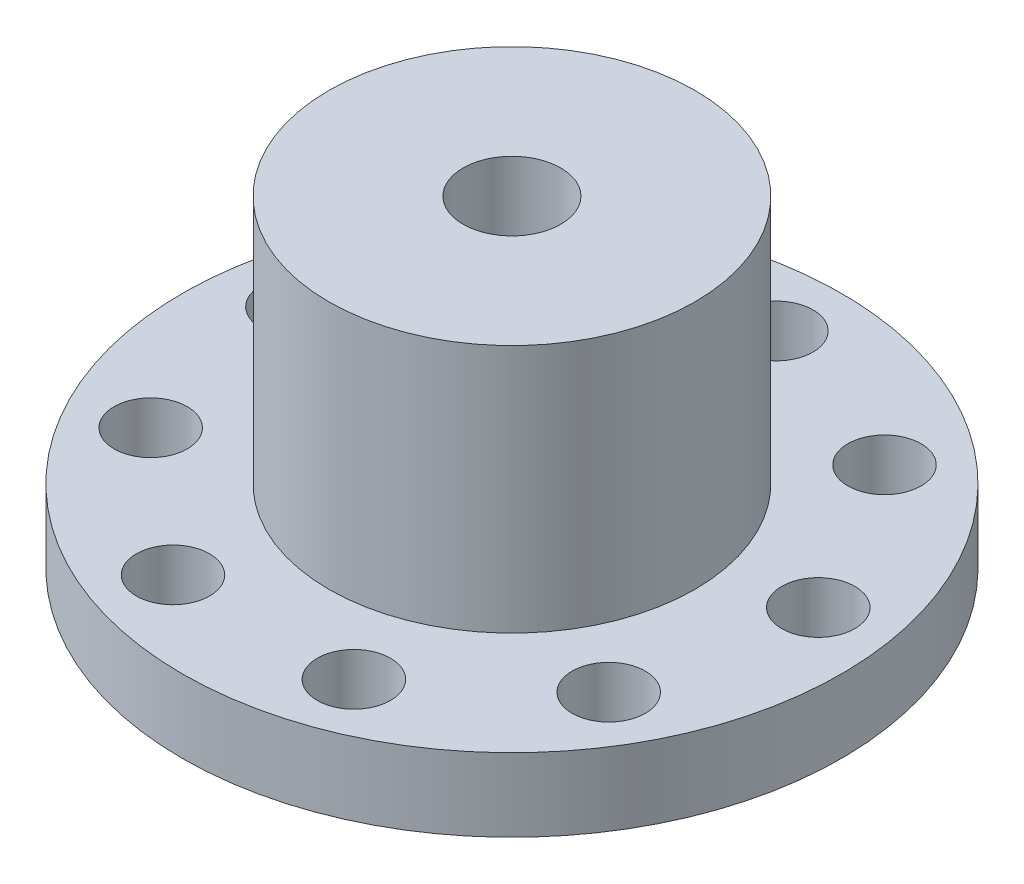
ISO-10303-21;
HEADER;
FILE_DESCRIPTION(('STEP AP214'),'2;1');
FILE_NAME('part.step','',(''),(''),'','','');
FILE_SCHEMA(('AUTOMOTIVE_DESIGN { 1 0 10303 214 1 1 1 1 }'));
ENDSEC;
DATA;
#1=APPLICATION_CONTEXT('core data for automotive mechanical design processes');
#2=APPLICATION_PROTOCOL_DEFINITION('international standard','automotive_design',2000,#1);
#3=PRODUCT_CONTEXT('',#1,'mechanical');
#4=PRODUCT('Part','Part','',(#3));
#5=PRODUCT_RELATED_PRODUCT_CATEGORY('part','',(#4));
#6=PRODUCT_DEFINITION_FORMATION('','',#4);
#7=PRODUCT_DEFINITION_CONTEXT('part definition',#1,'design');
#8=PRODUCT_DEFINITION('design','',#6,#7);
#9=PRODUCT_DEFINITION_SHAPE('','',#8);
#10=(LENGTH_UNIT() NAMED_UNIT(*) SI_UNIT(.MILLI.,.METRE.));
#11=(NAMED_UNIT(*) PLANE_ANGLE_UNIT() SI_UNIT($,.RADIAN.));
#12=(NAMED_UNIT(*) SI_UNIT($,.STERADIAN.) SOLID_ANGLE_UNIT());
#13=UNCERTAINTY_MEASURE_WITH_UNIT(LENGTH_MEASURE(1.E-05),#10,'distance_accuracy_value','');
#14=(GEOMETRIC_REPRESENTATION_CONTEXT(3) GLOBAL_UNCERTAINTY_ASSIGNED_CONTEXT((#13)) GLOBAL_UNIT_ASSIGNED_CONTEXT((#10,
#11,#12)) REPRESENTATION_CONTEXT('',''));
#15=CARTESIAN_POINT('',(0.,0.,0.));
#16=DIRECTION('',(0.,0.,1.));
#17=DIRECTION('',(1.,0.,0.));
#18=AXIS2_PLACEMENT_3D('',#15,#16,#17);
#19=CARTESIAN_POINT('',(0.,6.,0.));
#20=DIRECTION('',(0.,1.,0.));
#21=DIRECTION('',(0.,0.,1.));
#22=AXIS2_PLACEMENT_3D('',#19,#20,#21);
#23=PLANE('',#22);
#24=CARTESIAN_POINT('',(-13.9258890465933,6.,-16.5962283013456));
#25=DIRECTION('',(0.,1.,0.));
#26=DIRECTION('',(0.,0.,1.));
#27=AXIS2_PLACEMENT_3D('',#24,#25,#26);
#28=CIRCLE('',#27,3.);
#29=CARTESIAN_POINT('',(-13.9258890465933,6.,-13.5962283013456));
#30=VERTEX_POINT('',#29);
#31=EDGE_CURVE('E121',#30,#30,#28,.T.);
#32=ORIENTED_EDGE('',*,*,#31,.F.);
#33=EDGE_LOOP('',(#32));
#34=FACE_BOUND('',#33,.T.);
#35=CARTESIAN_POINT('',(-18.7622995572578,6.,10.8324187000008));
#36=DIRECTION('',(0.,1.,0.));
#37=DIRECTION('',(0.,0.,1.));
#38=AXIS2_PLACEMENT_3D('',#35,#36,#37);
#39=CIRCLE('',#38,3.);
#40=CARTESIAN_POINT('',(-18.7622995572578,6.,13.8324187000008));
#41=VERTEX_POINT('',#40);
#42=EDGE_CURVE('E105',#41,#41,#39,.T.);
#43=ORIENTED_EDGE('',*,*,#42,.F.);
#44=EDGE_LOOP('',(#43));
#45=FACE_BOUND('',#44,.T.);
#46=CARTESIAN_POINT('',(7.40981079267717,6.,20.3582878353062));
#47=DIRECTION('',(0.,1.,0.));
#48=DIRECTION('',(0.,0.,1.));
#49=AXIS2_PLACEMENT_3D('',#46,#47,#48);
#50=CIRCLE('',#49,3.);
#51=CARTESIAN_POINT('',(7.40981079267717,6.,23.3582878353062));
#52=VERTEX_POINT('',#51);
#53=EDGE_CURVE('E89',#52,#52,#50,.T.);
#54=ORIENTED_EDGE('',*,*,#53,.F.);
#55=EDGE_LOOP('',(#54));
#56=FACE_BOUND('',#55,.T.);
#57=CARTESIAN_POINT('',(21.3356998392696,6.,-3.7620595339613));
#58=DIRECTION('',(0.,1.,0.));
#59=DIRECTION('',(0.,0.,1.));
#60=AXIS2_PLACEMENT_3D('',#57,#58,#59);
#61=CIRCLE('',#60,3.);
#62=CARTESIAN_POINT('',(21.3356998392696,6.,-0.762059533961302));
#63=VERTEX_POINT('',#62);
#64=EDGE_CURVE('E73',#63,#63,#61,.T.);
#65=ORIENTED_EDGE('',*,*,#64,.F.);
#66=EDGE_LOOP('',(#65));
#67=FACE_BOUND('',#66,.T.);
#68=CARTESIAN_POINT('',(0.,6.,0.));
#69=DIRECTION('',(0.,1.,0.));
#70=DIRECTION('',(0.,0.,1.));
#71=AXIS2_PLACEMENT_3D('',#68,#69,#70);
#72=CIRCLE('',#71,27.);
#73=CARTESIAN_POINT('',(0.,6.,27.));
#74=VERTEX_POINT('',#73);
#75=EDGE_CURVE('E10',#74,#74,#72,.T.);
#76=ORIENTED_EDGE('',*,*,#75,.T.);
#77=EDGE_LOOP('',(#76));
#78=FACE_BOUND('',#77,.T.);
#79=CARTESIAN_POINT('',(0.,6.,-21.6648374));
#80=DIRECTION('',(0.,1.,0.));
#81=DIRECTION('',(0.,0.,1.));
#82=AXIS2_PLACEMENT_3D('',#79,#80,#81);
#83=CIRCLE('',#82,3.);
#84=CARTESIAN_POINT('',(0.,6.,-18.6648374));
#85=VERTEX_POINT('',#84);
#86=EDGE_CURVE('E55',#85,#85,#83,.T.);
#87=ORIENTED_EDGE('',*,*,#86,.F.);
#88=EDGE_LOOP('',(#87));
#89=FACE_BOUND('',#88,.T.);
#90=CARTESIAN_POINT('',(13.9258890465938,6.,-16.5962283013468));
#91=DIRECTION('',(0.,1.,0.));
#92=DIRECTION('',(0.,0.,1.));
#93=AXIS2_PLACEMENT_3D('',#90,#91,#92);
#94=CIRCLE('',#93,3.00000000000007);
#95=CARTESIAN_POINT('',(13.9258890465938,6.,-13.5962283013468));
#96=VERTEX_POINT('',#95);
#97=EDGE_CURVE('E68',#96,#96,#94,.T.);
#98=ORIENTED_EDGE('',*,*,#97,.F.);
#99=EDGE_LOOP('',(#98));
#100=FACE_BOUND('',#99,.T.);
#101=CARTESIAN_POINT('',(18.7622995572606,6.,10.8324186999992));
#102=DIRECTION('',(0.,1.,0.));
#103=DIRECTION('',(0.,0.,1.));
#104=AXIS2_PLACEMENT_3D('',#101,#102,#103);
#105=CIRCLE('',#104,3.);
#106=CARTESIAN_POINT('',(18.7622995572606,6.,13.8324186999992));
#107=VERTEX_POINT('',#106);
#108=EDGE_CURVE('E81',#107,#107,#105,.T.);
#109=ORIENTED_EDGE('',*,*,#108,.F.);
#110=EDGE_LOOP('',(#109));
#111=FACE_BOUND('',#110,.T.);
#112=CARTESIAN_POINT('',(-7.40981079267345,6.,20.3582878353069));
#113=DIRECTION('',(0.,1.,0.));
#114=DIRECTION('',(0.,0.,1.));
#115=AXIS2_PLACEMENT_3D('',#112,#113,#114);
#116=CIRCLE('',#115,3.);
#117=CARTESIAN_POINT('',(-7.40981079267345,6.,23.3582878353069));
#118=VERTEX_POINT('',#117);
#119=EDGE_CURVE('E97',#118,#118,#116,.T.);
#120=ORIENTED_EDGE('',*,*,#119,.F.);
#121=EDGE_LOOP('',(#120));
#122=FACE_BOUND('',#121,.T.);
#123=CARTESIAN_POINT('',(-21.3356998392681,6.,-3.76205953395941));
#124=DIRECTION('',(0.,1.,0.));
#125=DIRECTION('',(0.,0.,1.));
#126=AXIS2_PLACEMENT_3D('',#123,#124,#125);
#127=CIRCLE('',#126,3.);
#128=CARTESIAN_POINT('',(-21.3356998392681,6.,-0.762059533959405));
#129=VERTEX_POINT('',#128);
#130=EDGE_CURVE('E113',#129,#129,#127,.T.);
#131=ORIENTED_EDGE('',*,*,#130,.F.);
#132=EDGE_LOOP('',(#131));
#133=FACE_BOUND('',#132,.T.);
#134=CARTESIAN_POINT('',(0.,6.,0.));
#135=DIRECTION('',(0.,1.,0.));
#136=DIRECTION('',(0.,0.,1.));
#137=AXIS2_PLACEMENT_3D('',#134,#135,#136);
#138=CIRCLE('',#137,15.);
#139=CARTESIAN_POINT('',(0.,6.,15.));
#140=VERTEX_POINT('',#139);
#141=EDGE_CURVE('E133',#140,#140,#138,.T.);
#142=ORIENTED_EDGE('',*,*,#141,.F.);
#143=EDGE_LOOP('',(#142));
#144=FACE_BOUND('',#143,.T.);
#145=ADVANCED_FACE('F35',(#34,#45,#56,#67,#78,#89,#100,#111,#122,#133,#144),#23,.T.);
#146=CARTESIAN_POINT('',(0.,0.,0.));
#147=DIRECTION('',(0.,1.,0.));
#148=DIRECTION('',(0.,0.,1.));
#149=AXIS2_PLACEMENT_3D('',#146,#147,#148);
#150=PLANE('',#149);
#151=CARTESIAN_POINT('',(0.,0.,0.));
#152=DIRECTION('',(0.,1.,0.));
#153=DIRECTION('',(0.,0.,1.));
#154=AXIS2_PLACEMENT_3D('',#151,#152,#153);
#155=CIRCLE('',#154,27.);
#156=CARTESIAN_POINT('',(0.,0.,27.));
#157=VERTEX_POINT('',#156);
#158=EDGE_CURVE('E49',#157,#157,#155,.T.);
#159=ORIENTED_EDGE('',*,*,#158,.F.);
#160=EDGE_LOOP('',(#159));
#161=FACE_BOUND('',#160,.T.);
#162=CARTESIAN_POINT('',(0.,0.,-21.6648374));
#163=DIRECTION('',(0.,1.,0.));
#164=DIRECTION('',(0.,0.,1.));
#165=AXIS2_PLACEMENT_3D('',#162,#163,#164);
#166=CIRCLE('',#165,3.);
#167=CARTESIAN_POINT('',(0.,0.,-18.6648374));
#168=VERTEX_POINT('',#167);
#169=EDGE_CURVE('E57',#168,#168,#166,.T.);
#170=ORIENTED_EDGE('',*,*,#169,.T.);
#171=EDGE_LOOP('',(#170));
#172=FACE_BOUND('',#171,.T.);
#173=CARTESIAN_POINT('',(0.,0.,0.));
#174=DIRECTION('',(0.,1.,0.));
#175=DIRECTION('',(0.,0.,1.));
#176=AXIS2_PLACEMENT_3D('',#173,#174,#175);
#177=CIRCLE('',#176,4.);
#178=CARTESIAN_POINT('',(0.,0.,4.));
#179=VERTEX_POINT('',#178);
#180=EDGE_CURVE('E61',#179,#179,#177,.T.);
#181=ORIENTED_EDGE('',*,*,#180,.T.);
#182=EDGE_LOOP('',(#181));
#183=FACE_BOUND('',#182,.T.);
#184=CARTESIAN_POINT('',(13.9258890465938,0.,-16.5962283013468));
#185=DIRECTION('',(0.,1.,0.));
#186=DIRECTION('',(0.,0.,1.));
#187=AXIS2_PLACEMENT_3D('',#184,#185,#186);
#188=CIRCLE('',#187,3.00000000000007);
#189=CARTESIAN_POINT('',(13.9258890465938,0.,-13.5962283013468));
#190=VERTEX_POINT('',#189);
#191=EDGE_CURVE('E69',#190,#190,#188,.T.);
#192=ORIENTED_EDGE('',*,*,#191,.T.);
#193=EDGE_LOOP('',(#192));
#194=FACE_BOUND('',#193,.T.);
#195=CARTESIAN_POINT('',(21.3356998392696,0.,-3.7620595339613));
#196=DIRECTION('',(0.,1.,0.));
#197=DIRECTION('',(0.,0.,1.));
#198=AXIS2_PLACEMENT_3D('',#195,#196,#197);
#199=CIRCLE('',#198,3.);
#200=CARTESIAN_POINT('',(21.3356998392696,0.,-0.762059533961302));
#201=VERTEX_POINT('',#200);
#202=EDGE_CURVE('E77',#201,#201,#199,.T.);
#203=ORIENTED_EDGE('',*,*,#202,.T.);
#204=EDGE_LOOP('',(#203));
#205=FACE_BOUND('',#204,.T.);
#206=CARTESIAN_POINT('',(18.7622995572606,0.,10.8324186999992));
#207=DIRECTION('',(0.,1.,0.));
#208=DIRECTION('',(0.,0.,1.));
#209=AXIS2_PLACEMENT_3D('',#206,#207,#208);
#210=CIRCLE('',#209,3.);
#211=CARTESIAN_POINT('',(18.7622995572606,0.,13.8324186999992));
#212=VERTEX_POINT('',#211);
#213=EDGE_CURVE('E85',#212,#212,#210,.T.);
#214=ORIENTED_EDGE('',*,*,#213,.T.);
#215=EDGE_LOOP('',(#214));
#216=FACE_BOUND('',#215,.T.);
#217=CARTESIAN_POINT('',(7.40981079267717,0.,20.3582878353062));
#218=DIRECTION('',(0.,1.,0.));
#219=DIRECTION('',(0.,0.,1.));
#220=AXIS2_PLACEMENT_3D('',#217,#218,#219);
#221=CIRCLE('',#220,3.);
#222=CARTESIAN_POINT('',(7.40981079267717,0.,23.3582878353062));
#223=VERTEX_POINT('',#222);
#224=EDGE_CURVE('E93',#223,#223,#221,.T.);
#225=ORIENTED_EDGE('',*,*,#224,.T.);
#226=EDGE_LOOP('',(#225));
#227=FACE_BOUND('',#226,.T.);
#228=CARTESIAN_POINT('',(-7.40981079267345,0.,20.3582878353069));
#229=DIRECTION('',(0.,1.,0.));
#230=DIRECTION('',(0.,0.,1.));
#231=AXIS2_PLACEMENT_3D('',#228,#229,#230);
#232=CIRCLE('',#231,3.);
#233=CARTESIAN_POINT('',(-7.40981079267345,0.,23.3582878353069));
#234=VERTEX_POINT('',#233);
#235=EDGE_CURVE('E101',#234,#234,#232,.T.);
#236=ORIENTED_EDGE('',*,*,#235,.T.);
#237=EDGE_LOOP('',(#236));
#238=FACE_BOUND('',#237,.T.);
#239=CARTESIAN_POINT('',(-18.7622995572578,0.,10.8324187000008));
#240=DIRECTION('',(0.,1.,0.));
#241=DIRECTION('',(0.,0.,1.));
#242=AXIS2_PLACEMENT_3D('',#239,#240,#241);
#243=CIRCLE('',#242,3.);
#244=CARTESIAN_POINT('',(-18.7622995572578,0.,13.8324187000008));
#245=VERTEX_POINT('',#244);
#246=EDGE_CURVE('E109',#245,#245,#243,.T.);
#247=ORIENTED_EDGE('',*,*,#246,.T.);
#248=EDGE_LOOP('',(#247));
#249=FACE_BOUND('',#248,.T.);
#250=CARTESIAN_POINT('',(-21.3356998392681,0.,-3.76205953395941));
#251=DIRECTION('',(0.,1.,0.));
#252=DIRECTION('',(0.,0.,1.));
#253=AXIS2_PLACEMENT_3D('',#250,#251,#252);
#254=CIRCLE('',#253,3.);
#255=CARTESIAN_POINT('',(-21.3356998392681,0.,-0.762059533959405));
#256=VERTEX_POINT('',#255);
#257=EDGE_CURVE('E117',#256,#256,#254,.T.);
#258=ORIENTED_EDGE('',*,*,#257,.T.);
#259=EDGE_LOOP('',(#258));
#260=FACE_BOUND('',#259,.T.);
#261=CARTESIAN_POINT('',(-13.9258890465933,0.,-16.5962283013456));
#262=DIRECTION('',(0.,1.,0.));
#263=DIRECTION('',(0.,0.,1.));
#264=AXIS2_PLACEMENT_3D('',#261,#262,#263);
#265=CIRCLE('',#264,3.);
#266=CARTESIAN_POINT('',(-13.9258890465933,0.,-13.5962283013456));
#267=VERTEX_POINT('',#266);
#268=EDGE_CURVE('E125',#267,#267,#265,.T.);
#269=ORIENTED_EDGE('',*,*,#268,.T.);
#270=EDGE_LOOP('',(#269));
#271=FACE_BOUND('',#270,.T.);
#272=ADVANCED_FACE('F206',(#161,#172,#183,#194,#205,#216,#227,#238,#249,#260,#271),#150,.F.);
#273=CARTESIAN_POINT('',(0.,6.,0.));
#274=DIRECTION('',(0.,-1.,0.));
#275=DIRECTION('',(0.,0.,-1.));
#276=AXIS2_PLACEMENT_3D('',#273,#274,#275);
#277=CYLINDRICAL_SURFACE('',#276,27.);
#278=ORIENTED_EDGE('',*,*,#75,.F.);
#279=EDGE_LOOP('',(#278));
#280=FACE_BOUND('',#279,.T.);
#281=ORIENTED_EDGE('',*,*,#158,.T.);
#282=EDGE_LOOP('',(#281));
#283=FACE_BOUND('',#282,.T.);
#284=ADVANCED_FACE('F37',(#280,#283),#277,.T.);
#285=CARTESIAN_POINT('',(0.,6.,-21.6648374));
#286=DIRECTION('',(0.,-1.,0.));
#287=DIRECTION('',(0.,0.,-1.));
#288=AXIS2_PLACEMENT_3D('',#285,#286,#287);
#289=CYLINDRICAL_SURFACE('',#288,3.);
#290=ORIENTED_EDGE('',*,*,#86,.T.);
#291=EDGE_LOOP('',(#290));
#292=FACE_BOUND('',#291,.T.);
#293=ORIENTED_EDGE('',*,*,#169,.F.);
#294=EDGE_LOOP('',(#293));
#295=FACE_BOUND('',#294,.T.);
#296=ADVANCED_FACE('F202',(#292,#295),#289,.F.);
#297=CARTESIAN_POINT('',(0.,6.,0.));
#298=DIRECTION('',(0.,-1.,0.));
#299=DIRECTION('',(0.,0.,-1.));
#300=AXIS2_PLACEMENT_3D('',#297,#298,#299);
#301=CYLINDRICAL_SURFACE('',#300,4.);
#302=CARTESIAN_POINT('',(0.,18.7000000000002,-4.));
#303=CARTESIAN_POINT('',(-0.127017476559873,18.6999895238565,-3.99999041333571));
#304=CARTESIAN_POINT('',(-0.254191951791705,18.6902535000985,-3.9938860659399));
#305=CARTESIAN_POINT('',(-0.504637456621347,18.6518288703159,-3.97004375552586));
#306=CARTESIAN_POINT('',(-0.627900575825987,18.6231041397389,-3.95228361873137));
#307=CARTESIAN_POINT('',(-0.86641086826916,18.5483771467126,-3.90691695293563));
#308=CARTESIAN_POINT('',(-0.981694420709426,18.5024603902125,-3.87935918690877));
#309=CARTESIAN_POINT('',(-1.20252080434994,18.3952283325086,-3.81669199838278));
#310=CARTESIAN_POINT('',(-1.30806471304097,18.3339147374469,-3.7815834126609));
#311=CARTESIAN_POINT('',(-1.51594836437076,18.1922268434089,-3.70340304945467));
#312=CARTESIAN_POINT('',(-1.61735911616788,18.1107213972983,-3.6599192421789));
#313=CARTESIAN_POINT('',(-1.80597275567281,17.9335616537415,-3.57062700058923));
#314=CARTESIAN_POINT('',(-1.893156215944,17.8378883442611,-3.52481549782959));
#315=CARTESIAN_POINT('',(-2.06285746302515,17.6199322107088,-3.4286083723563));
#316=CARTESIAN_POINT('',(-2.1431441201831,17.495800426569,-3.37843221966151));
#317=CARTESIAN_POINT('',(-2.28147932079986,17.2328703693216,-3.28660396278111));
#318=CARTESIAN_POINT('',(-2.33956541787428,17.094097374832,-3.24493752000468));
#319=CARTESIAN_POINT('',(-2.41866801180563,16.8423789524542,-3.18619151248824));
#320=CARTESIAN_POINT('',(-2.44539104794665,16.7320663630816,-3.16553811970896));
#321=CARTESIAN_POINT('',(-2.48363687119124,16.5073881486192,-3.13562714660873));
#322=CARTESIAN_POINT('',(-2.4951811248562,16.3930284828267,-3.1263534737847));
#323=CARTESIAN_POINT('',(-2.50237836690477,16.1631739671235,-3.12059771534517));
#324=CARTESIAN_POINT('',(-2.49798968200863,16.047676929422,-3.12414917427975));
#325=CARTESIAN_POINT('',(-2.47352633347805,15.8193797912733,-3.1435480488343));
#326=CARTESIAN_POINT('',(-2.45343909745125,15.70658192715,-3.15940531965508));
#327=CARTESIAN_POINT('',(-2.39936209464233,15.4891231032563,-3.20065145822166));
#328=CARTESIAN_POINT('',(-2.36570043522576,15.3843351202825,-3.22581428653592));
#329=CARTESIAN_POINT('',(-2.28580369589476,15.1816776035267,-3.2829113444344));
#330=CARTESIAN_POINT('',(-2.23956416894007,15.0838105321565,-3.31484796808545));
#331=CARTESIAN_POINT('',(-2.12589830407225,14.8783335924897,-3.38909625095681));
#332=CARTESIAN_POINT('',(-2.05612773657709,14.7723189481475,-3.43223155208573));
#333=CARTESIAN_POINT('',(-1.90176111958595,14.5723388730235,-3.52011451554737));
#334=CARTESIAN_POINT('',(-1.81714983251296,14.4783859999548,-3.56486379714045));
#335=CARTESIAN_POINT('',(-1.61904732877686,14.2893989904173,-3.65959667460618));
#336=CARTESIAN_POINT('',(-1.50309447419966,14.1967440572783,-3.70922571443749));
#337=CARTESIAN_POINT('',(-1.2542644446846,14.032288206369,-3.80056601840688));
#338=CARTESIAN_POINT('',(-1.1213939512695,13.9604790921905,-3.84228039228689));
#339=CARTESIAN_POINT('',(-0.915775751566871,13.872654043365,-3.89435975869916));
#340=CARTESIAN_POINT('',(-0.848193583186823,13.8471657135696,-3.90966874385281));
#341=CARTESIAN_POINT('',(-0.710492049477878,13.8019923495214,-3.93701839875455));
#342=CARTESIAN_POINT('',(-0.640374175967334,13.7823039634293,-3.94906095588043));
#343=CARTESIAN_POINT('',(-0.498239019537913,13.7490658383577,-3.96949699527856));
#344=CARTESIAN_POINT('',(-0.42622350091472,13.7355105964741,-3.9778937484389));
#345=CARTESIAN_POINT('',(-0.280965673560186,13.7147537066866,-3.99078766491334));
#346=CARTESIAN_POINT('',(-0.207723576570211,13.7075509734528,-3.99528549435856));
#347=CARTESIAN_POINT('',(-0.00911917689627858,13.6968906953566,-4.00193773474167));
#348=CARTESIAN_POINT('',(0.116782016706213,13.6995996368767,-4.00023812236599));
#349=CARTESIAN_POINT('',(0.365967766012163,13.7237596644657,-3.98518313408301));
#350=CARTESIAN_POINT('',(0.489252499360433,13.745209473925,-3.97182855210096));
#351=CARTESIAN_POINT('',(0.725036194003069,13.804478587983,-3.93547975555361));
#352=CARTESIAN_POINT('',(0.837768421063376,13.8416247207701,-3.91288306371117));
#353=CARTESIAN_POINT('',(1.05527816125377,13.9305923713127,-3.85991402897862));
#354=CARTESIAN_POINT('',(1.16005433861644,13.9824163465017,-3.82954038411628));
#355=CARTESIAN_POINT('',(1.37016761969238,14.1050305375082,-3.75980014020642));
#356=CARTESIAN_POINT('',(1.47449380296948,14.1772071722754,-3.71983526755356));
#357=CARTESIAN_POINT('',(1.67028541330115,14.3355876964697,-3.63613942885707));
#358=CARTESIAN_POINT('',(1.76173634038067,14.4218071688861,-3.59240430473113));
#359=CARTESIAN_POINT('',(1.94294835276293,14.6202700898461,-3.49811738486707));
#360=CARTESIAN_POINT('',(2.03053702733677,14.734474415498,-3.44749766579168));
#361=CARTESIAN_POINT('',(2.18560704916476,14.9777515669831,-3.35133525746869));
#362=CARTESIAN_POINT('',(2.25310231693803,15.1068140128918,-3.30578906708345));
#363=CARTESIAN_POINT('',(2.3536954382105,15.3493842966001,-3.23467060578816));
#364=CARTESIAN_POINT('',(2.39103791720714,15.4604815013892,-3.20691272363783));
#365=CARTESIAN_POINT('',(2.45000216420773,15.6887862916139,-3.16210061351232));
#366=CARTESIAN_POINT('',(2.47164849805275,15.8059840196899,-3.14502966529801));
#367=CARTESIAN_POINT('',(2.49802767469247,16.0441805529709,-3.12412649932584));
#368=CARTESIAN_POINT('',(2.50266374586488,16.1651971678804,-3.1203700319315));
#369=CARTESIAN_POINT('',(2.49439556773548,16.4062619238299,-3.12698126375705));
#370=CARTESIAN_POINT('',(2.48148548821473,16.5263097296198,-3.13735365770467));
#371=CARTESIAN_POINT('',(2.44076547086119,16.7520595794365,-3.16910777009978));
#372=CARTESIAN_POINT('',(2.41423847191734,16.8581385645028,-3.18953614189064));
#373=CARTESIAN_POINT('',(2.34835238743438,17.0642701575186,-3.23835062785217));
#374=CARTESIAN_POINT('',(2.30898795090792,17.1643202318176,-3.26674005971301));
#375=CARTESIAN_POINT('',(2.21205415803969,17.3711933243385,-3.33327797617845));
#376=CARTESIAN_POINT('',(2.15267427981676,17.4768999462641,-3.37224428524074));
#377=CARTESIAN_POINT('',(2.01999894889215,17.6778773857096,-3.45335445323991));
#378=CARTESIAN_POINT('',(1.94669224594692,17.7731396673744,-3.49550086438996));
#379=CARTESIAN_POINT('',(1.77134669685945,17.9700255837988,-3.58803675426844));
#380=CARTESIAN_POINT('',(1.66649284489896,18.0691697615396,-3.63840488260276));
#381=CARTESIAN_POINT('',(1.43961937990849,18.2490015961254,-3.7339805383823));
#382=CARTESIAN_POINT('',(1.31758921196649,18.3296778236778,-3.77918486147259));
#383=CARTESIAN_POINT('',(1.12346357942548,18.434563438559,-3.83959214728416));
#384=CARTESIAN_POINT('',(1.05679601158092,18.4668748000473,-3.85851834157058));
#385=CARTESIAN_POINT('',(0.920199584374031,18.5256722518241,-3.89335165397883));
#386=CARTESIAN_POINT('',(0.850272633931951,18.5521617011354,-3.90926051225921));
#387=CARTESIAN_POINT('',(0.707873688437728,18.5988571444624,-3.93753374175518));
#388=CARTESIAN_POINT('',(0.635409144572224,18.6190800572459,-3.94990764965184));
#389=CARTESIAN_POINT('',(0.488456989557071,18.6529754555826,-3.97075677458059));
#390=CARTESIAN_POINT('',(0.413970913545483,18.6666527724397,-3.97923486692924));
#391=CARTESIAN_POINT('',(0.282852605094011,18.6845904102269,-3.99038271291772));
#392=CARTESIAN_POINT('',(0.226501515914837,18.6903615302524,-3.99398159517595));
#393=CARTESIAN_POINT('',(0.11344407451903,18.6980687836273,-3.99879245372932));
#394=CARTESIAN_POINT('',(0.056737700531297,18.7000046796105,-4.00000428228699));
#395=CARTESIAN_POINT('',(0.,18.7000000000002,-4.));
#396=B_SPLINE_CURVE_WITH_KNOTS('',3,(#302,#303,#304,#305,#306,#307,#308,#309,#310,#311,#312,
#313,#314,#315,#316,#317,#318,#319,#320,#321,#322,#323,#324,#325,#326,#327,#328,#329,#330,#331,
#332,#333,#334,#335,#336,#337,#338,#339,#340,#341,#342,#343,#344,#345,#346,#347,#348,#349,#350,
#351,#352,#353,#354,#355,#356,#357,#358,#359,#360,#361,#362,#363,#364,#365,#366,#367,#368,#369,
#370,#371,#372,#373,#374,#375,#376,#377,#378,#379,#380,#381,#382,#383,#384,#385,#386,#387,#388,
#389,#390,#391,#392,#393,#394,#395),.UNSPECIFIED.,.T.,.F.,(4,2,2,2,2,2,2,2,2,2,2,2,2,2,2,2,2,2,
2,2,2,2,2,2,2,2,2,2,2,2,2,2,2,2,2,2,2,2,2,2,2,2,2,2,2,2,4),(0.,0.380824602868271,
0.762375788256934,1.14205397519029,1.52169010807761,1.93164374107246,2.34215256651407,
2.80825951705949,3.27357449214024,3.61824017759437,3.96241789414785,4.30749646997559,
4.65285169010169,4.99031678920878,5.32790135816073,5.7285490070873,6.12961045150378,
6.59684361399059,7.06389281455738,7.28510978359969,7.50619865744394,7.72708876613716,
7.947941128313,8.32363778110182,8.69930884379595,9.06028425977632,9.42132014771968,
9.81879878896143,10.2167215457041,10.6724083464247,11.1277787130887,11.4876929754248,
11.8470427174174,12.2084336629144,12.5699447204276,12.9023575499051,13.2349091154191,
13.6156046298899,13.9966089922257,14.4531049498526,14.9098826607204,15.1389848639481,
15.3679545348469,15.5963005225023,15.8244777070606,15.994578512822,16.1646898459841),.UNSPECIFIED.);
#397=CARTESIAN_POINT('',(0.,18.7000000000002,-4.));
#398=VERTEX_POINT('',#397);
#399=EDGE_CURVE('E144',#398,#398,#396,.T.);
#400=ORIENTED_EDGE('',*,*,#399,.F.);
#401=EDGE_LOOP('',(#400));
#402=FACE_BOUND('',#401,.T.);
#403=ORIENTED_EDGE('',*,*,#180,.F.);
#404=EDGE_LOOP('',(#403));
#405=FACE_BOUND('',#404,.T.);
#406=CARTESIAN_POINT('',(0.,26.4,0.));
#407=DIRECTION('',(0.,1.,0.));
#408=DIRECTION('',(0.,0.,1.));
#409=AXIS2_PLACEMENT_3D('',#406,#407,#408);
#410=CIRCLE('',#409,4.);
#411=CARTESIAN_POINT('',(0.,26.4,4.));
#412=VERTEX_POINT('',#411);
#413=EDGE_CURVE('E137',#412,#412,#410,.T.);
#414=ORIENTED_EDGE('',*,*,#413,.T.);
#415=EDGE_LOOP('',(#414));
#416=FACE_BOUND('',#415,.T.);
#417=ADVANCED_FACE('F151',(#402,#405,#416),#301,.F.);
#418=CARTESIAN_POINT('',(13.9258890465938,6.,-16.5962283013468));
#419=DIRECTION('',(0.,-1.,0.));
#420=DIRECTION('',(0.,0.,-1.));
#421=AXIS2_PLACEMENT_3D('',#418,#419,#420);
#422=CYLINDRICAL_SURFACE('',#421,3.00000000000007);
#423=ORIENTED_EDGE('',*,*,#97,.T.);
#424=EDGE_LOOP('',(#423));
#425=FACE_BOUND('',#424,.T.);
#426=ORIENTED_EDGE('',*,*,#191,.F.);
#427=EDGE_LOOP('',(#426));
#428=FACE_BOUND('',#427,.T.);
#429=ADVANCED_FACE('F195',(#425,#428),#422,.F.);
#430=CARTESIAN_POINT('',(21.3356998392696,6.,-3.7620595339613));
#431=DIRECTION('',(0.,-1.,0.));
#432=DIRECTION('',(0.,0.,-1.));
#433=AXIS2_PLACEMENT_3D('',#430,#431,#432);
#434=CYLINDRICAL_SURFACE('',#433,3.);
#435=ORIENTED_EDGE('',*,*,#64,.T.);
#436=EDGE_LOOP('',(#435));
#437=FACE_BOUND('',#436,.T.);
#438=ORIENTED_EDGE('',*,*,#202,.F.);
#439=EDGE_LOOP('',(#438));
#440=FACE_BOUND('',#439,.T.);
#441=ADVANCED_FACE('F192',(#437,#440),#434,.F.);
#442=CARTESIAN_POINT('',(18.7622995572606,6.,10.8324186999992));
#443=DIRECTION('',(0.,-1.,0.));
#444=DIRECTION('',(0.,0.,-1.));
#445=AXIS2_PLACEMENT_3D('',#442,#443,#444);
#446=CYLINDRICAL_SURFACE('',#445,3.);
#447=ORIENTED_EDGE('',*,*,#108,.T.);
#448=EDGE_LOOP('',(#447));
#449=FACE_BOUND('',#448,.T.);
#450=ORIENTED_EDGE('',*,*,#213,.F.);
#451=EDGE_LOOP('',(#450));
#452=FACE_BOUND('',#451,.T.);
#453=ADVANCED_FACE('F188',(#449,#452),#446,.F.);
#454=CARTESIAN_POINT('',(7.40981079267717,6.,20.3582878353062));
#455=DIRECTION('',(0.,-1.,0.));
#456=DIRECTION('',(0.,0.,-1.));
#457=AXIS2_PLACEMENT_3D('',#454,#455,#456);
#458=CYLINDRICAL_SURFACE('',#457,3.);
#459=ORIENTED_EDGE('',*,*,#53,.T.);
#460=EDGE_LOOP('',(#459));
#461=FACE_BOUND('',#460,.T.);
#462=ORIENTED_EDGE('',*,*,#224,.F.);
#463=EDGE_LOOP('',(#462));
#464=FACE_BOUND('',#463,.T.);
#465=ADVANCED_FACE('F184',(#461,#464),#458,.F.);
#466=CARTESIAN_POINT('',(-7.40981079267345,6.,20.3582878353069));
#467=DIRECTION('',(0.,-1.,0.));
#468=DIRECTION('',(0.,0.,-1.));
#469=AXIS2_PLACEMENT_3D('',#466,#467,#468);
#470=CYLINDRICAL_SURFACE('',#469,3.);
#471=ORIENTED_EDGE('',*,*,#119,.T.);
#472=EDGE_LOOP('',(#471));
#473=FACE_BOUND('',#472,.T.);
#474=ORIENTED_EDGE('',*,*,#235,.F.);
#475=EDGE_LOOP('',(#474));
#476=FACE_BOUND('',#475,.T.);
#477=ADVANCED_FACE('F180',(#473,#476),#470,.F.);
#478=CARTESIAN_POINT('',(-18.7622995572578,6.,10.8324187000008));
#479=DIRECTION('',(0.,-1.,0.));
#480=DIRECTION('',(0.,0.,-1.));
#481=AXIS2_PLACEMENT_3D('',#478,#479,#480);
#482=CYLINDRICAL_SURFACE('',#481,3.);
#483=ORIENTED_EDGE('',*,*,#42,.T.);
#484=EDGE_LOOP('',(#483));
#485=FACE_BOUND('',#484,.T.);
#486=ORIENTED_EDGE('',*,*,#246,.F.);
#487=EDGE_LOOP('',(#486));
#488=FACE_BOUND('',#487,.T.);
#489=ADVANCED_FACE('F176',(#485,#488),#482,.F.);
#490=CARTESIAN_POINT('',(-21.3356998392681,6.,-3.76205953395941));
#491=DIRECTION('',(0.,-1.,0.));
#492=DIRECTION('',(0.,0.,-1.));
#493=AXIS2_PLACEMENT_3D('',#490,#491,#492);
#494=CYLINDRICAL_SURFACE('',#493,3.);
#495=ORIENTED_EDGE('',*,*,#130,.T.);
#496=EDGE_LOOP('',(#495));
#497=FACE_BOUND('',#496,.T.);
#498=ORIENTED_EDGE('',*,*,#257,.F.);
#499=EDGE_LOOP('',(#498));
#500=FACE_BOUND('',#499,.T.);
#501=ADVANCED_FACE('F172',(#497,#500),#494,.F.);
#502=CARTESIAN_POINT('',(-13.9258890465933,6.,-16.5962283013456));
#503=DIRECTION('',(0.,-1.,0.));
#504=DIRECTION('',(0.,0.,-1.));
#505=AXIS2_PLACEMENT_3D('',#502,#503,#504);
#506=CYLINDRICAL_SURFACE('',#505,3.);
#507=ORIENTED_EDGE('',*,*,#31,.T.);
#508=EDGE_LOOP('',(#507));
#509=FACE_BOUND('',#508,.T.);
#510=ORIENTED_EDGE('',*,*,#268,.F.);
#511=EDGE_LOOP('',(#510));
#512=FACE_BOUND('',#511,.T.);
#513=ADVANCED_FACE('F164',(#509,#512),#506,.F.);
#514=CARTESIAN_POINT('',(0.,26.4,0.));
#515=DIRECTION('',(0.,1.,0.));
#516=DIRECTION('',(0.,0.,1.));
#517=AXIS2_PLACEMENT_3D('',#514,#515,#516);
#518=PLANE('',#517);
#519=CARTESIAN_POINT('',(0.,26.4,0.));
#520=DIRECTION('',(0.,1.,0.));
#521=DIRECTION('',(0.,0.,1.));
#522=AXIS2_PLACEMENT_3D('',#519,#520,#521);
#523=CIRCLE('',#522,15.);
#524=CARTESIAN_POINT('',(0.,26.4,15.));
#525=VERTEX_POINT('',#524);
#526=EDGE_CURVE('E129',#525,#525,#523,.T.);
#527=ORIENTED_EDGE('',*,*,#526,.T.);
#528=EDGE_LOOP('',(#527));
#529=FACE_BOUND('',#528,.T.);
#530=ORIENTED_EDGE('',*,*,#413,.F.);
#531=EDGE_LOOP('',(#530));
#532=FACE_BOUND('',#531,.T.);
#533=ADVANCED_FACE('F161',(#529,#532),#518,.T.);
#534=CARTESIAN_POINT('',(0.,26.4,0.));
#535=DIRECTION('',(0.,-1.,0.));
#536=DIRECTION('',(0.,0.,-1.));
#537=AXIS2_PLACEMENT_3D('',#534,#535,#536);
#538=CYLINDRICAL_SURFACE('',#537,15.);
#539=CARTESIAN_POINT('',(0.,18.7000000000002,-15.));
#540=CARTESIAN_POINT('',(-0.139390904958215,18.6999944110523,-14.9999976116882));
#541=CARTESIAN_POINT('',(-0.27885788183882,18.6883027250312,-14.9980367791303));
#542=CARTESIAN_POINT('',(-0.553880221673037,18.6418643412348,-14.9904034494139));
#543=CARTESIAN_POINT('',(-0.689431867959238,18.6070964430885,-14.9847275392389));
#544=CARTESIAN_POINT('',(-0.952604747212625,18.5155845514073,-14.9703006823645));
#545=CARTESIAN_POINT('',(-1.08023236843188,18.4588585343595,-14.9615522515919));
#546=CARTESIAN_POINT('',(-1.3241418419779,18.3250877079476,-14.9419422708207));
#547=CARTESIAN_POINT('',(-1.44042498987854,18.248045222517,-14.9310809625443));
#548=CARTESIAN_POINT('',(-1.65947261429161,18.0750449161795,-14.9083331745831));
#549=CARTESIAN_POINT('',(-1.76211290353489,17.9789308853638,-14.8964387181486));
#550=CARTESIAN_POINT('',(-1.94988849865983,17.7708520315271,-14.8730262687673));
#551=CARTESIAN_POINT('',(-2.03502269939086,17.6588862085433,-14.8615082996267));
#552=CARTESIAN_POINT('',(-2.185867125605,17.4214290338029,-14.8400756575978));
#553=CARTESIAN_POINT('',(-2.25145455286085,17.2958586631952,-14.8301712909164));
#554=CARTESIAN_POINT('',(-2.36055836541104,17.0352904356993,-14.8131978979468));
#555=CARTESIAN_POINT('',(-2.40407624156542,16.9002932163223,-14.8061286801431));
#556=CARTESIAN_POINT('',(-2.46741437778458,16.6260197251434,-14.7957053684276));
#557=CARTESIAN_POINT('',(-2.48744902913516,16.4867942634985,-14.792317684857));
#558=CARTESIAN_POINT('',(-2.5039167252896,16.2069197231164,-14.7895393893665));
#559=CARTESIAN_POINT('',(-2.50035144038871,16.0662707458326,-14.7901484945722));
#560=CARTESIAN_POINT('',(-2.46989509839583,15.7890721387244,-14.7952642886356));
#561=CARTESIAN_POINT('',(-2.44324488188944,15.6524951964547,-14.7997307331892));
#562=CARTESIAN_POINT('',(-2.36775314040308,15.3857786821708,-14.8119949521101));
#563=CARTESIAN_POINT('',(-2.31891085431936,15.2556393311114,-14.8197928407328));
#564=CARTESIAN_POINT('',(-2.2001772460935,15.004771176559,-14.8378847933411));
#565=CARTESIAN_POINT('',(-2.13018591387929,14.8840905939187,-14.8481906710733));
#566=CARTESIAN_POINT('',(-1.97121201755698,14.6560955994616,-14.8701291841501));
#567=CARTESIAN_POINT('',(-1.88222792065383,14.548782267545,-14.8817619265429));
#568=CARTESIAN_POINT('',(-1.68648221215857,14.3491739141926,-14.9052202787979));
#569=CARTESIAN_POINT('',(-1.57951396387263,14.2570814814599,-14.9170464923166));
#570=CARTESIAN_POINT('',(-1.35153524898113,14.0921222373347,-14.9394260139673));
#571=CARTESIAN_POINT('',(-1.2305246919059,14.0192555498168,-14.9499793138975));
#572=CARTESIAN_POINT('',(-0.977705916166174,13.8947977728638,-14.9686389289292));
#573=CARTESIAN_POINT('',(-0.845888725564118,13.8432245806688,-14.9767431840745));
#574=CARTESIAN_POINT('',(-0.575298345602181,13.7630057847541,-14.9895750301266));
#575=CARTESIAN_POINT('',(-0.436525739178915,13.7343582630264,-14.9943029035048));
#576=CARTESIAN_POINT('',(-0.157709901301068,13.701078641539,-14.9998112984269));
#577=CARTESIAN_POINT('',(-0.0177007371504564,13.6961684281946,-15.0006375301278));
#578=CARTESIAN_POINT('',(0.261139772890439,13.7097613444283,-14.9983747442117));
#579=CARTESIAN_POINT('',(0.399971163892587,13.728263573134,-14.9952858772412));
#580=CARTESIAN_POINT('',(0.671656175547304,13.7879248493357,-14.985568269382));
#581=CARTESIAN_POINT('',(0.804540868385915,13.8289462083904,-14.9789610480131));
#582=CARTESIAN_POINT('',(1.06154688486097,13.9323345181998,-14.9629446445536));
#583=CARTESIAN_POINT('',(1.18566771591024,13.9947026676356,-14.9535353051202));
#584=CARTESIAN_POINT('',(1.42283068946946,14.1396511246971,-14.932845163024));
#585=CARTESIAN_POINT('',(1.53576525093764,14.2224051561676,-14.9215485588702));
#586=CARTESIAN_POINT('',(1.74624358550316,14.4055373153854,-14.898384673919));
#587=CARTESIAN_POINT('',(1.84378623969704,14.505916723277,-14.8865173517154));
#588=CARTESIAN_POINT('',(2.02174277965844,14.7226975480718,-14.8634017523584));
#589=CARTESIAN_POINT('',(2.10196876111414,14.8392541655148,-14.852161161371));
#590=CARTESIAN_POINT('',(2.24170231029538,15.084352969139,-14.8317152977788));
#591=CARTESIAN_POINT('',(2.30121053477021,15.2128947752279,-14.8225099606601));
#592=CARTESIAN_POINT('',(2.3975383314735,15.4777897328126,-14.807234536977));
#593=CARTESIAN_POINT('',(2.43445143254828,15.6141080950309,-14.8011515431106));
#594=CARTESIAN_POINT('',(2.48483545377858,15.8911201292222,-14.7927771683526));
#595=CARTESIAN_POINT('',(2.49830841194646,16.0318134197325,-14.7904854578272));
#596=CARTESIAN_POINT('',(2.50137286604761,16.3117051659629,-14.7899673308401));
#597=CARTESIAN_POINT('',(2.49126013612543,16.4509003785757,-14.7916905650565));
#598=CARTESIAN_POINT('',(2.44807983895706,16.7255792480512,-14.7988978145372));
#599=CARTESIAN_POINT('',(2.41501234611267,16.8610629169423,-14.8043818176121));
#600=CARTESIAN_POINT('',(2.32697448959507,17.124358437293,-14.8184735628172));
#601=CARTESIAN_POINT('',(2.2720295906006,17.2521790100564,-14.8270776721967));
#602=CARTESIAN_POINT('',(2.14182700391604,17.4968356691953,-14.8464436892221));
#603=CARTESIAN_POINT('',(2.06656830874868,17.6136712103725,-14.857205703884));
#604=CARTESIAN_POINT('',(1.89681888437225,17.8345355831081,-14.8798345404562));
#605=CARTESIAN_POINT('',(1.80211056359373,17.9383960167006,-14.891712955763));
#606=CARTESIAN_POINT('',(1.59660903138029,18.1288516044753,-14.9151437236084));
#607=CARTESIAN_POINT('',(1.48581211291269,18.2154427686385,-14.9266960002655));
#608=CARTESIAN_POINT('',(1.25036916964031,18.3694482682003,-14.9482652964222));
#609=CARTESIAN_POINT('',(1.12563278753284,18.4367260393132,-14.958271162531));
#610=CARTESIAN_POINT('',(0.866513069378994,18.5492694846102,-14.9755116760178));
#611=CARTESIAN_POINT('',(0.732139494830017,18.5945570810799,-14.9827490817748));
#612=CARTESIAN_POINT('',(0.497703310045403,18.6520052741269,-14.9920579083296));
#613=CARTESIAN_POINT('',(0.399058830298448,18.6699744696162,-14.9950202727336));
#614=CARTESIAN_POINT('',(0.200289310319809,18.6939737378449,-14.9989921598612));
#615=CARTESIAN_POINT('',(0.100164295608494,18.7000040161375,-15.0000017162064));
#616=CARTESIAN_POINT('',(0.,18.7000000000002,-15.));
#617=B_SPLINE_CURVE_WITH_KNOTS('',3,(#539,#540,#541,#542,#543,#544,#545,#546,#547,#548,#549,
#550,#551,#552,#553,#554,#555,#556,#557,#558,#559,#560,#561,#562,#563,#564,#565,#566,#567,#568,
#569,#570,#571,#572,#573,#574,#575,#576,#577,#578,#579,#580,#581,#582,#583,#584,#585,#586,#587,
#588,#589,#590,#591,#592,#593,#594,#595,#596,#597,#598,#599,#600,#601,#602,#603,#604,#605,#606,
#607,#608,#609,#610,#611,#612,#613,#614,#615,#616),.UNSPECIFIED.,.T.,.F.,(4,2,2,2,2,2,2,2,2,2,2,
2,2,2,2,2,2,2,2,2,2,2,2,2,2,2,2,2,2,2,2,2,2,2,2,2,2,2,4),(0.,0.41780658493851,0.835997545695421,
1.25384686702527,1.67164841267479,2.09302491062332,2.51442800169857,2.93842520823841,
3.36239376876182,3.78246077103424,4.20249804320886,4.61820521760408,5.03392665025381,
5.45164556632557,5.86939820680574,6.29232769911327,6.71525991635848,7.13854688915903,
7.56179844521148,7.98007883491396,8.39834313035859,8.81407807006415,9.22983635826066,
9.64926825627023,10.0687306305428,10.4925382200762,10.9163323737594,11.3383602234177,
11.7603513778662,12.177079095227,12.5938054618813,13.0100481822622,13.4263115502933,
13.8475138419339,14.2688133387897,14.693022316072,15.1168075213007,15.4170424816402,
15.7172722727697),.UNSPECIFIED.);
#618=CARTESIAN_POINT('',(0.,18.7000000000002,-15.));
#619=VERTEX_POINT('',#618);
#620=EDGE_CURVE('E39',#619,#619,#617,.T.);
#621=ORIENTED_EDGE('',*,*,#620,.T.);
#622=EDGE_LOOP('',(#621));
#623=FACE_BOUND('',#622,.T.);
#624=ORIENTED_EDGE('',*,*,#526,.F.);
#625=EDGE_LOOP('',(#624));
#626=FACE_BOUND('',#625,.T.);
#627=ORIENTED_EDGE('',*,*,#141,.T.);
#628=EDGE_LOOP('',(#627));
#629=FACE_BOUND('',#628,.T.);
#630=ADVANCED_FACE('F159',(#623,#626,#629),#538,.T.);
#631=CARTESIAN_POINT('',(3.58225985365309E-13,16.2000000000002,-27.0000000000002));
#632=DIRECTION('',(0.,0.,1.));
#633=DIRECTION('',(1.,0.,0.));
#634=AXIS2_PLACEMENT_3D('',#631,#632,#633);
#635=CYLINDRICAL_SURFACE('',#634,2.5);
#636=ORIENTED_EDGE('',*,*,#399,.T.);
#637=EDGE_LOOP('',(#636));
#638=FACE_BOUND('',#637,.T.);
#639=ORIENTED_EDGE('',*,*,#620,.F.);
#640=EDGE_LOOP('',(#639));
#641=FACE_BOUND('',#640,.T.);
#642=ADVANCED_FACE('F155',(#638,#641),#635,.F.);
#643=CLOSED_SHELL('',(#145,#272,#284,#296,#417,#429,#441,#453,#465,#477,#489,#501,#513,#533,
#630,#642));
#644=MANIFOLD_SOLID_BREP('B2',#643);
#645=ADVANCED_BREP_SHAPE_REPRESENTATION('',(#18,#644),#14);
#646=SHAPE_DEFINITION_REPRESENTATION(#9,#645);
ENDSEC;
END-ISO-10303-21;
